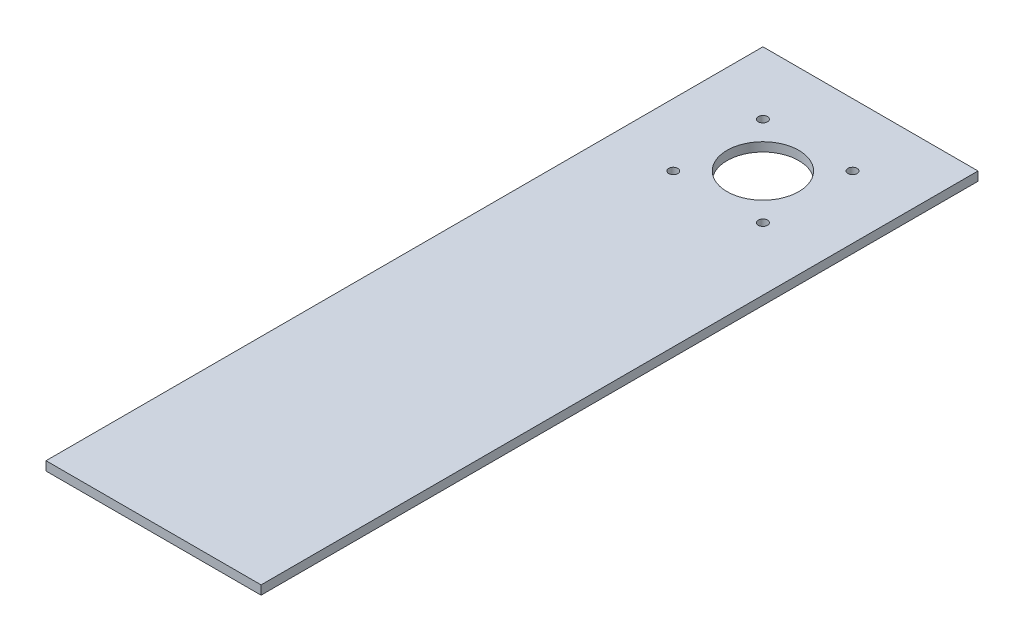
ISO-10303-21;
HEADER;
FILE_DESCRIPTION(('STEP AP214'),'2;1');
FILE_NAME('part.step','',(''),(''),'','','');
FILE_SCHEMA(('AUTOMOTIVE_DESIGN { 1 0 10303 214 1 1 1 1 }'));
ENDSEC;
DATA;
#1=APPLICATION_CONTEXT('core data for automotive mechanical design processes');
#2=APPLICATION_PROTOCOL_DEFINITION('international standard','automotive_design',2000,#1);
#3=PRODUCT_CONTEXT('',#1,'mechanical');
#4=PRODUCT('Part','Part','',(#3));
#5=PRODUCT_RELATED_PRODUCT_CATEGORY('part','',(#4));
#6=PRODUCT_DEFINITION_FORMATION('','',#4);
#7=PRODUCT_DEFINITION_CONTEXT('part definition',#1,'design');
#8=PRODUCT_DEFINITION('design','',#6,#7);
#9=PRODUCT_DEFINITION_SHAPE('','',#8);
#10=(LENGTH_UNIT() NAMED_UNIT(*) SI_UNIT(.MILLI.,.METRE.));
#11=(NAMED_UNIT(*) PLANE_ANGLE_UNIT() SI_UNIT($,.RADIAN.));
#12=(NAMED_UNIT(*) SI_UNIT($,.STERADIAN.) SOLID_ANGLE_UNIT());
#13=UNCERTAINTY_MEASURE_WITH_UNIT(LENGTH_MEASURE(1.E-05),#10,'distance_accuracy_value','');
#14=(GEOMETRIC_REPRESENTATION_CONTEXT(3) GLOBAL_UNCERTAINTY_ASSIGNED_CONTEXT((#13)) GLOBAL_UNIT_ASSIGNED_CONTEXT((#10,
#11,#12)) REPRESENTATION_CONTEXT('',''));
#15=CARTESIAN_POINT('',(0.,0.,0.));
#16=DIRECTION('',(0.,0.,1.));
#17=DIRECTION('',(1.,0.,0.));
#18=AXIS2_PLACEMENT_3D('',#15,#16,#17);
#19=CARTESIAN_POINT('',(0.,5.,0.));
#20=DIRECTION('',(0.,-1.,0.));
#21=DIRECTION('',(0.,0.,-1.));
#22=AXIS2_PLACEMENT_3D('',#19,#20,#21);
#23=PLANE('',#22);
#24=DIRECTION('',(0.,0.,1.));
#25=VECTOR('',#24,1.);
#26=CARTESIAN_POINT('',(-60.0000000000006,5.,-60.));
#27=LINE('',#26,#25);
#28=CARTESIAN_POINT('',(-60.0000000000006,5.,-60.));
#29=VERTEX_POINT('',#28);
#30=CARTESIAN_POINT('',(-60.0000000000006,5.,340.));
#31=VERTEX_POINT('',#30);
#32=EDGE_CURVE('E76',#29,#31,#27,.T.);
#33=ORIENTED_EDGE('',*,*,#32,.T.);
#34=DIRECTION('',(-1.,0.,0.));
#35=VECTOR('',#34,1.);
#36=CARTESIAN_POINT('',(-60.0000000000006,5.,340.));
#37=LINE('',#36,#35);
#38=CARTESIAN_POINT('',(60.0000000000005,5.,340.));
#39=VERTEX_POINT('',#38);
#40=EDGE_CURVE('E108',#39,#31,#37,.T.);
#41=ORIENTED_EDGE('',*,*,#40,.F.);
#42=DIRECTION('',(0.,0.,-1.));
#43=VECTOR('',#42,1.);
#44=CARTESIAN_POINT('',(60.0000000000006,5.,-60.));
#45=LINE('',#44,#43);
#46=CARTESIAN_POINT('',(60.0000000000006,5.,-60.));
#47=VERTEX_POINT('',#46);
#48=EDGE_CURVE('E157',#39,#47,#45,.T.);
#49=ORIENTED_EDGE('',*,*,#48,.T.);
#50=DIRECTION('',(-1.,0.,0.));
#51=VECTOR('',#50,1.);
#52=CARTESIAN_POINT('',(60.0000000000006,5.,-60.));
#53=LINE('',#52,#51);
#54=EDGE_CURVE('E60',#47,#29,#53,.T.);
#55=ORIENTED_EDGE('',*,*,#54,.T.);
#56=EDGE_LOOP('',(#33,#41,#49,#55));
#57=FACE_BOUND('',#56,.T.);
#58=CARTESIAN_POINT('',(-25.0000010149837,5.,25.0000010149835));
#59=DIRECTION('',(0.,1.,0.));
#60=DIRECTION('',(0.,0.,1.));
#61=AXIS2_PLACEMENT_3D('',#58,#59,#60);
#62=CIRCLE('',#61,2.55);
#63=CARTESIAN_POINT('',(-25.0000010149837,5.,27.5500010149835));
#64=VERTEX_POINT('',#63);
#65=EDGE_CURVE('E96',#64,#64,#62,.T.);
#66=ORIENTED_EDGE('',*,*,#65,.F.);
#67=EDGE_LOOP('',(#66));
#68=FACE_BOUND('',#67,.T.);
#69=CARTESIAN_POINT('',(24.9999989850164,5.,24.9999989850165));
#70=DIRECTION('',(0.,1.,0.));
#71=DIRECTION('',(0.,0.,1.));
#72=AXIS2_PLACEMENT_3D('',#69,#70,#71);
#73=CIRCLE('',#72,2.55);
#74=CARTESIAN_POINT('',(24.9999989850164,5.,27.5499989850165));
#75=VERTEX_POINT('',#74);
#76=EDGE_CURVE('E141',#75,#75,#73,.T.);
#77=ORIENTED_EDGE('',*,*,#76,.F.);
#78=EDGE_LOOP('',(#77));
#79=FACE_BOUND('',#78,.T.);
#80=CARTESIAN_POINT('',(25.0000010149833,5.,-25.0000010149836));
#81=DIRECTION('',(0.,1.,0.));
#82=DIRECTION('',(0.,0.,1.));
#83=AXIS2_PLACEMENT_3D('',#80,#81,#82);
#84=CIRCLE('',#83,2.55);
#85=CARTESIAN_POINT('',(25.0000010149833,5.,-22.4500010149836));
#86=VERTEX_POINT('',#85);
#87=EDGE_CURVE('E133',#86,#86,#84,.T.);
#88=ORIENTED_EDGE('',*,*,#87,.F.);
#89=EDGE_LOOP('',(#88));
#90=FACE_BOUND('',#89,.T.);
#91=CARTESIAN_POINT('',(-24.9999989850167,5.,-24.9999989850164));
#92=DIRECTION('',(0.,1.,0.));
#93=DIRECTION('',(0.,0.,1.));
#94=AXIS2_PLACEMENT_3D('',#91,#92,#93);
#95=CIRCLE('',#94,2.55);
#96=CARTESIAN_POINT('',(-24.9999989850167,5.,-22.4499989850164));
#97=VERTEX_POINT('',#96);
#98=EDGE_CURVE('E125',#97,#97,#95,.T.);
#99=ORIENTED_EDGE('',*,*,#98,.F.);
#100=EDGE_LOOP('',(#99));
#101=FACE_BOUND('',#100,.T.);
#102=CARTESIAN_POINT('',(0.,5.,0.));
#103=DIRECTION('',(0.,1.,0.));
#104=DIRECTION('',(0.,0.,1.));
#105=AXIS2_PLACEMENT_3D('',#102,#103,#104);
#106=CIRCLE('',#105,20.);
#107=CARTESIAN_POINT('',(0.,5.,20.));
#108=VERTEX_POINT('',#107);
#109=EDGE_CURVE('E117',#108,#108,#106,.T.);
#110=ORIENTED_EDGE('',*,*,#109,.F.);
#111=EDGE_LOOP('',(#110));
#112=FACE_BOUND('',#111,.T.);
#113=ADVANCED_FACE('F42',(#57,#68,#79,#90,#101,#112),#23,.F.);
#114=CARTESIAN_POINT('',(0.,0.,0.));
#115=DIRECTION('',(0.,-1.,0.));
#116=DIRECTION('',(0.,0.,-1.));
#117=AXIS2_PLACEMENT_3D('',#114,#115,#116);
#118=PLANE('',#117);
#119=CARTESIAN_POINT('',(-24.9999989850167,0.,-24.9999989850164));
#120=DIRECTION('',(0.,1.,0.));
#121=DIRECTION('',(0.,0.,1.));
#122=AXIS2_PLACEMENT_3D('',#119,#120,#121);
#123=CIRCLE('',#122,2.55);
#124=CARTESIAN_POINT('',(-24.9999989850167,0.,-22.4499989850164));
#125=VERTEX_POINT('',#124);
#126=EDGE_CURVE('E121',#125,#125,#123,.T.);
#127=ORIENTED_EDGE('',*,*,#126,.T.);
#128=EDGE_LOOP('',(#127));
#129=FACE_BOUND('',#128,.T.);
#130=CARTESIAN_POINT('',(24.9999989850164,0.,24.9999989850165));
#131=DIRECTION('',(0.,1.,0.));
#132=DIRECTION('',(0.,0.,1.));
#133=AXIS2_PLACEMENT_3D('',#130,#131,#132);
#134=CIRCLE('',#133,2.55);
#135=CARTESIAN_POINT('',(24.9999989850164,0.,27.5499989850165));
#136=VERTEX_POINT('',#135);
#137=EDGE_CURVE('E137',#136,#136,#134,.T.);
#138=ORIENTED_EDGE('',*,*,#137,.T.);
#139=EDGE_LOOP('',(#138));
#140=FACE_BOUND('',#139,.T.);
#141=DIRECTION('',(0.,0.,1.));
#142=VECTOR('',#141,1.);
#143=CARTESIAN_POINT('',(-60.0000000000006,0.,-60.));
#144=LINE('',#143,#142);
#145=CARTESIAN_POINT('',(-60.0000000000006,0.,-60.));
#146=VERTEX_POINT('',#145);
#147=CARTESIAN_POINT('',(-60.0000000000006,0.,340.));
#148=VERTEX_POINT('',#147);
#149=EDGE_CURVE('E89',#146,#148,#144,.T.);
#150=ORIENTED_EDGE('',*,*,#149,.F.);
#151=DIRECTION('',(-1.,0.,0.));
#152=VECTOR('',#151,1.);
#153=CARTESIAN_POINT('',(60.0000000000006,0.,-60.));
#154=LINE('',#153,#152);
#155=CARTESIAN_POINT('',(60.0000000000006,0.,-60.));
#156=VERTEX_POINT('',#155);
#157=EDGE_CURVE('E158',#156,#146,#154,.T.);
#158=ORIENTED_EDGE('',*,*,#157,.F.);
#159=DIRECTION('',(0.,0.,-1.));
#160=VECTOR('',#159,1.);
#161=CARTESIAN_POINT('',(60.0000000000006,0.,-60.));
#162=LINE('',#161,#160);
#163=CARTESIAN_POINT('',(60.0000000000005,0.,340.));
#164=VERTEX_POINT('',#163);
#165=EDGE_CURVE('E71',#164,#156,#162,.T.);
#166=ORIENTED_EDGE('',*,*,#165,.F.);
#167=DIRECTION('',(1.,0.,0.));
#168=VECTOR('',#167,1.);
#169=CARTESIAN_POINT('',(-60.0000000000006,0.,340.));
#170=LINE('',#169,#168);
#171=EDGE_CURVE('E99',#148,#164,#170,.T.);
#172=ORIENTED_EDGE('',*,*,#171,.F.);
#173=EDGE_LOOP('',(#150,#158,#166,#172));
#174=FACE_BOUND('',#173,.T.);
#175=CARTESIAN_POINT('',(-25.0000010149837,0.,25.0000010149835));
#176=DIRECTION('',(0.,1.,0.));
#177=DIRECTION('',(0.,0.,1.));
#178=AXIS2_PLACEMENT_3D('',#175,#176,#177);
#179=CIRCLE('',#178,2.55);
#180=CARTESIAN_POINT('',(-25.0000010149837,0.,27.5500010149835));
#181=VERTEX_POINT('',#180);
#182=EDGE_CURVE('E145',#181,#181,#179,.T.);
#183=ORIENTED_EDGE('',*,*,#182,.T.);
#184=EDGE_LOOP('',(#183));
#185=FACE_BOUND('',#184,.T.);
#186=CARTESIAN_POINT('',(25.0000010149833,0.,-25.0000010149836));
#187=DIRECTION('',(0.,1.,0.));
#188=DIRECTION('',(0.,0.,1.));
#189=AXIS2_PLACEMENT_3D('',#186,#187,#188);
#190=CIRCLE('',#189,2.55);
#191=CARTESIAN_POINT('',(25.0000010149833,0.,-22.4500010149836));
#192=VERTEX_POINT('',#191);
#193=EDGE_CURVE('E129',#192,#192,#190,.T.);
#194=ORIENTED_EDGE('',*,*,#193,.T.);
#195=EDGE_LOOP('',(#194));
#196=FACE_BOUND('',#195,.T.);
#197=CARTESIAN_POINT('',(0.,0.,0.));
#198=DIRECTION('',(0.,1.,0.));
#199=DIRECTION('',(0.,0.,1.));
#200=AXIS2_PLACEMENT_3D('',#197,#198,#199);
#201=CIRCLE('',#200,20.);
#202=CARTESIAN_POINT('',(0.,0.,20.));
#203=VERTEX_POINT('',#202);
#204=EDGE_CURVE('E116',#203,#203,#201,.T.);
#205=ORIENTED_EDGE('',*,*,#204,.T.);
#206=EDGE_LOOP('',(#205));
#207=FACE_BOUND('',#206,.T.);
#208=ADVANCED_FACE('F100',(#129,#140,#174,#185,#196,#207),#118,.T.);
#209=CARTESIAN_POINT('',(-60.0000000000006,5.,-60.));
#210=DIRECTION('',(1.,0.,0.));
#211=DIRECTION('',(0.,0.,-1.));
#212=AXIS2_PLACEMENT_3D('',#209,#210,#211);
#213=PLANE('',#212);
#214=ORIENTED_EDGE('',*,*,#149,.T.);
#215=DIRECTION('',(0.,-1.,0.));
#216=VECTOR('',#215,1.);
#217=CARTESIAN_POINT('',(-60.0000000000006,5.,340.));
#218=LINE('',#217,#216);
#219=EDGE_CURVE('E92',#31,#148,#218,.T.);
#220=ORIENTED_EDGE('',*,*,#219,.F.);
#221=ORIENTED_EDGE('',*,*,#32,.F.);
#222=DIRECTION('',(0.,-1.,0.));
#223=VECTOR('',#222,1.);
#224=CARTESIAN_POINT('',(-60.0000000000006,5.,-60.));
#225=LINE('',#224,#223);
#226=EDGE_CURVE('E52',#29,#146,#225,.T.);
#227=ORIENTED_EDGE('',*,*,#226,.T.);
#228=EDGE_LOOP('',(#214,#220,#221,#227));
#229=FACE_BOUND('',#228,.T.);
#230=ADVANCED_FACE('F44',(#229),#213,.F.);
#231=CARTESIAN_POINT('',(60.0000000000006,5.,-60.));
#232=DIRECTION('',(-1.,0.,0.));
#233=DIRECTION('',(0.,0.,1.));
#234=AXIS2_PLACEMENT_3D('',#231,#232,#233);
#235=PLANE('',#234);
#236=ORIENTED_EDGE('',*,*,#165,.T.);
#237=DIRECTION('',(0.,-1.,0.));
#238=VECTOR('',#237,1.);
#239=CARTESIAN_POINT('',(60.0000000000006,5.,-60.));
#240=LINE('',#239,#238);
#241=EDGE_CURVE('E11',#47,#156,#240,.T.);
#242=ORIENTED_EDGE('',*,*,#241,.F.);
#243=ORIENTED_EDGE('',*,*,#48,.F.);
#244=DIRECTION('',(0.,1.,0.));
#245=VECTOR('',#244,1.);
#246=CARTESIAN_POINT('',(60.0000000000005,5.,340.));
#247=LINE('',#246,#245);
#248=EDGE_CURVE('E105',#164,#39,#247,.T.);
#249=ORIENTED_EDGE('',*,*,#248,.F.);
#250=EDGE_LOOP('',(#236,#242,#243,#249));
#251=FACE_BOUND('',#250,.T.);
#252=ADVANCED_FACE('F169',(#251),#235,.F.);
#253=CARTESIAN_POINT('',(60.0000000000006,5.,-60.));
#254=DIRECTION('',(0.,0.,1.));
#255=DIRECTION('',(1.,0.,0.));
#256=AXIS2_PLACEMENT_3D('',#253,#254,#255);
#257=PLANE('',#256);
#258=ORIENTED_EDGE('',*,*,#157,.T.);
#259=ORIENTED_EDGE('',*,*,#226,.F.);
#260=ORIENTED_EDGE('',*,*,#54,.F.);
#261=ORIENTED_EDGE('',*,*,#241,.T.);
#262=EDGE_LOOP('',(#258,#259,#260,#261));
#263=FACE_BOUND('',#262,.T.);
#264=ADVANCED_FACE('F168',(#263),#257,.F.);
#265=CARTESIAN_POINT('',(-25.0000010149837,5.,25.0000010149835));
#266=DIRECTION('',(0.,-1.,0.));
#267=DIRECTION('',(0.,0.,-1.));
#268=AXIS2_PLACEMENT_3D('',#265,#266,#267);
#269=CYLINDRICAL_SURFACE('',#268,2.55);
#270=ORIENTED_EDGE('',*,*,#65,.T.);
#271=EDGE_LOOP('',(#270));
#272=FACE_BOUND('',#271,.T.);
#273=ORIENTED_EDGE('',*,*,#182,.F.);
#274=EDGE_LOOP('',(#273));
#275=FACE_BOUND('',#274,.T.);
#276=ADVANCED_FACE('F200',(#272,#275),#269,.F.);
#277=CARTESIAN_POINT('',(24.9999989850164,5.,24.9999989850165));
#278=DIRECTION('',(0.,-1.,0.));
#279=DIRECTION('',(0.,0.,-1.));
#280=AXIS2_PLACEMENT_3D('',#277,#278,#279);
#281=CYLINDRICAL_SURFACE('',#280,2.55);
#282=ORIENTED_EDGE('',*,*,#76,.T.);
#283=EDGE_LOOP('',(#282));
#284=FACE_BOUND('',#283,.T.);
#285=ORIENTED_EDGE('',*,*,#137,.F.);
#286=EDGE_LOOP('',(#285));
#287=FACE_BOUND('',#286,.T.);
#288=ADVANCED_FACE('F217',(#284,#287),#281,.F.);
#289=CARTESIAN_POINT('',(25.0000010149833,5.,-25.0000010149836));
#290=DIRECTION('',(0.,-1.,0.));
#291=DIRECTION('',(0.,0.,-1.));
#292=AXIS2_PLACEMENT_3D('',#289,#290,#291);
#293=CYLINDRICAL_SURFACE('',#292,2.55);
#294=ORIENTED_EDGE('',*,*,#87,.T.);
#295=EDGE_LOOP('',(#294));
#296=FACE_BOUND('',#295,.T.);
#297=ORIENTED_EDGE('',*,*,#193,.F.);
#298=EDGE_LOOP('',(#297));
#299=FACE_BOUND('',#298,.T.);
#300=ADVANCED_FACE('F224',(#296,#299),#293,.F.);
#301=CARTESIAN_POINT('',(-24.9999989850167,5.,-24.9999989850164));
#302=DIRECTION('',(0.,-1.,0.));
#303=DIRECTION('',(0.,0.,-1.));
#304=AXIS2_PLACEMENT_3D('',#301,#302,#303);
#305=CYLINDRICAL_SURFACE('',#304,2.55);
#306=ORIENTED_EDGE('',*,*,#98,.T.);
#307=EDGE_LOOP('',(#306));
#308=FACE_BOUND('',#307,.T.);
#309=ORIENTED_EDGE('',*,*,#126,.F.);
#310=EDGE_LOOP('',(#309));
#311=FACE_BOUND('',#310,.T.);
#312=ADVANCED_FACE('F186',(#308,#311),#305,.F.);
#313=CARTESIAN_POINT('',(0.,5.,0.));
#314=DIRECTION('',(0.,-1.,0.));
#315=DIRECTION('',(0.,0.,-1.));
#316=AXIS2_PLACEMENT_3D('',#313,#314,#315);
#317=CYLINDRICAL_SURFACE('',#316,20.);
#318=ORIENTED_EDGE('',*,*,#109,.T.);
#319=EDGE_LOOP('',(#318));
#320=FACE_BOUND('',#319,.T.);
#321=ORIENTED_EDGE('',*,*,#204,.F.);
#322=EDGE_LOOP('',(#321));
#323=FACE_BOUND('',#322,.T.);
#324=ADVANCED_FACE('F183',(#320,#323),#317,.F.);
#325=CARTESIAN_POINT('',(0.,0.,340.));
#326=DIRECTION('',(0.,0.,1.));
#327=DIRECTION('',(1.,0.,0.));
#328=AXIS2_PLACEMENT_3D('',#325,#326,#327);
#329=PLANE('',#328);
#330=ORIENTED_EDGE('',*,*,#219,.T.);
#331=ORIENTED_EDGE('',*,*,#171,.T.);
#332=ORIENTED_EDGE('',*,*,#248,.T.);
#333=ORIENTED_EDGE('',*,*,#40,.T.);
#334=EDGE_LOOP('',(#330,#331,#332,#333));
#335=FACE_BOUND('',#334,.T.);
#336=ADVANCED_FACE('F107',(#335),#329,.T.);
#337=CLOSED_SHELL('',(#113,#208,#230,#252,#264,#276,#288,#300,#312,#324,#336));
#338=MANIFOLD_SOLID_BREP('B2',#337);
#339=ADVANCED_BREP_SHAPE_REPRESENTATION('',(#18,#338),#14);
#340=SHAPE_DEFINITION_REPRESENTATION(#9,#339);
ENDSEC;
END-ISO-10303-21;
